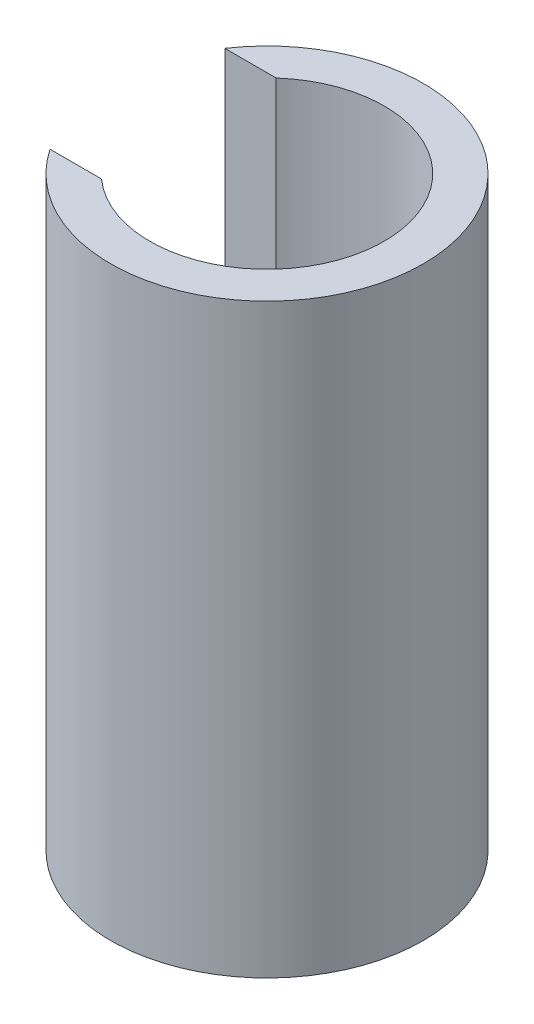
ISO-10303-21;
HEADER;
FILE_DESCRIPTION(('STEP AP214'),'2;1');
FILE_NAME('part.step','',(''),(''),'','','');
FILE_SCHEMA(('AUTOMOTIVE_DESIGN { 1 0 10303 214 1 1 1 1 }'));
ENDSEC;
DATA;
#1=APPLICATION_CONTEXT('core data for automotive mechanical design processes');
#2=APPLICATION_PROTOCOL_DEFINITION('international standard','automotive_design',2000,#1);
#3=PRODUCT_CONTEXT('',#1,'mechanical');
#4=PRODUCT('Part','Part','',(#3));
#5=PRODUCT_RELATED_PRODUCT_CATEGORY('part','',(#4));
#6=PRODUCT_DEFINITION_FORMATION('','',#4);
#7=PRODUCT_DEFINITION_CONTEXT('part definition',#1,'design');
#8=PRODUCT_DEFINITION('design','',#6,#7);
#9=PRODUCT_DEFINITION_SHAPE('','',#8);
#10=(LENGTH_UNIT() NAMED_UNIT(*) SI_UNIT(.MILLI.,.METRE.));
#11=(NAMED_UNIT(*) PLANE_ANGLE_UNIT() SI_UNIT($,.RADIAN.));
#12=(NAMED_UNIT(*) SI_UNIT($,.STERADIAN.) SOLID_ANGLE_UNIT());
#13=UNCERTAINTY_MEASURE_WITH_UNIT(LENGTH_MEASURE(1.E-05),#10,'distance_accuracy_value','');
#14=(GEOMETRIC_REPRESENTATION_CONTEXT(3) GLOBAL_UNCERTAINTY_ASSIGNED_CONTEXT((#13)) GLOBAL_UNIT_ASSIGNED_CONTEXT((#10,
#11,#12)) REPRESENTATION_CONTEXT('',''));
#15=CARTESIAN_POINT('',(0.,0.,0.));
#16=DIRECTION('',(0.,0.,1.));
#17=DIRECTION('',(1.,0.,0.));
#18=AXIS2_PLACEMENT_3D('',#15,#16,#17);
#19=CARTESIAN_POINT('',(0.,15.,0.));
#20=DIRECTION('',(0.,1.,0.));
#21=DIRECTION('',(0.,0.,1.));
#22=AXIS2_PLACEMENT_3D('',#19,#20,#21);
#23=PLANE('',#22);
#24=DIRECTION('',(-1.,0.,0.));
#25=VECTOR('',#24,1.);
#26=CARTESIAN_POINT('',(-4.,15.,-2.23606797749979));
#27=LINE('',#26,#25);
#28=CARTESIAN_POINT('',(-2.,15.,-2.23606797749979));
#29=VERTEX_POINT('',#28);
#30=CARTESIAN_POINT('',(-3.3166247903554,15.,-2.23606797749979));
#31=VERTEX_POINT('',#30);
#32=EDGE_CURVE('E97',#29,#31,#27,.T.);
#33=ORIENTED_EDGE('',*,*,#32,.F.);
#34=CARTESIAN_POINT('',(0.,15.,0.));
#35=DIRECTION('',(0.,1.,0.));
#36=DIRECTION('',(0.,0.,1.));
#37=AXIS2_PLACEMENT_3D('',#34,#35,#36);
#38=CIRCLE('',#37,3.);
#39=CARTESIAN_POINT('',(-2.,15.,2.23606797749979));
#40=VERTEX_POINT('',#39);
#41=EDGE_CURVE('E101',#40,#29,#38,.T.);
#42=ORIENTED_EDGE('',*,*,#41,.F.);
#43=DIRECTION('',(1.,0.,0.));
#44=VECTOR('',#43,1.);
#45=CARTESIAN_POINT('',(-4.,15.,2.23606797749979));
#46=LINE('',#45,#44);
#47=CARTESIAN_POINT('',(-3.3166247903554,15.,2.23606797749979));
#48=VERTEX_POINT('',#47);
#49=EDGE_CURVE('E63',#48,#40,#46,.T.);
#50=ORIENTED_EDGE('',*,*,#49,.F.);
#51=CARTESIAN_POINT('',(0.,15.,0.));
#52=DIRECTION('',(0.,1.,0.));
#53=DIRECTION('',(0.,0.,1.));
#54=AXIS2_PLACEMENT_3D('',#51,#52,#53);
#55=CIRCLE('',#54,4.);
#56=EDGE_CURVE('E11',#48,#31,#55,.T.);
#57=ORIENTED_EDGE('',*,*,#56,.T.);
#58=EDGE_LOOP('',(#33,#42,#50,#57));
#59=FACE_BOUND('',#58,.T.);
#60=ADVANCED_FACE('F39',(#59),#23,.T.);
#61=CARTESIAN_POINT('',(0.,0.,0.));
#62=DIRECTION('',(0.,1.,0.));
#63=DIRECTION('',(0.,0.,1.));
#64=AXIS2_PLACEMENT_3D('',#61,#62,#63);
#65=PLANE('',#64);
#66=CARTESIAN_POINT('',(0.,0.,0.));
#67=DIRECTION('',(0.,1.,0.));
#68=DIRECTION('',(0.,0.,1.));
#69=AXIS2_PLACEMENT_3D('',#66,#67,#68);
#70=CIRCLE('',#69,3.);
#71=CARTESIAN_POINT('',(-2.,0.,2.23606797749979));
#72=VERTEX_POINT('',#71);
#73=CARTESIAN_POINT('',(-2.,0.,-2.23606797749979));
#74=VERTEX_POINT('',#73);
#75=EDGE_CURVE('E94',#72,#74,#70,.T.);
#76=ORIENTED_EDGE('',*,*,#75,.T.);
#77=DIRECTION('',(-1.,0.,0.));
#78=VECTOR('',#77,1.);
#79=CARTESIAN_POINT('',(-4.,0.,-2.23606797749979));
#80=LINE('',#79,#78);
#81=CARTESIAN_POINT('',(-3.3166247903554,0.,-2.23606797749979));
#82=VERTEX_POINT('',#81);
#83=EDGE_CURVE('E55',#74,#82,#80,.T.);
#84=ORIENTED_EDGE('',*,*,#83,.T.);
#85=CARTESIAN_POINT('',(0.,0.,0.));
#86=DIRECTION('',(0.,1.,0.));
#87=DIRECTION('',(0.,0.,1.));
#88=AXIS2_PLACEMENT_3D('',#85,#86,#87);
#89=CIRCLE('',#88,4.);
#90=CARTESIAN_POINT('',(-3.3166247903554,0.,2.23606797749979));
#91=VERTEX_POINT('',#90);
#92=EDGE_CURVE('E43',#91,#82,#89,.T.);
#93=ORIENTED_EDGE('',*,*,#92,.F.);
#94=DIRECTION('',(1.,0.,0.));
#95=VECTOR('',#94,1.);
#96=CARTESIAN_POINT('',(-4.,0.,2.23606797749979));
#97=LINE('',#96,#95);
#98=EDGE_CURVE('E81',#91,#72,#97,.T.);
#99=ORIENTED_EDGE('',*,*,#98,.T.);
#100=EDGE_LOOP('',(#76,#84,#93,#99));
#101=FACE_BOUND('',#100,.T.);
#102=ADVANCED_FACE('F93',(#101),#65,.F.);
#103=CARTESIAN_POINT('',(0.,15.,0.));
#104=DIRECTION('',(0.,-1.,0.));
#105=DIRECTION('',(0.,0.,-1.));
#106=AXIS2_PLACEMENT_3D('',#103,#104,#105);
#107=CYLINDRICAL_SURFACE('',#106,4.);
#108=ORIENTED_EDGE('',*,*,#92,.T.);
#109=DIRECTION('',(0.,-1.,0.));
#110=VECTOR('',#109,1.);
#111=CARTESIAN_POINT('',(-3.3166247903554,15.,-2.23606797749979));
#112=LINE('',#111,#110);
#113=EDGE_CURVE('E102',#82,#31,#112,.F.);
#114=ORIENTED_EDGE('',*,*,#113,.T.);
#115=ORIENTED_EDGE('',*,*,#56,.F.);
#116=DIRECTION('',(0.,-1.,0.));
#117=VECTOR('',#116,1.);
#118=CARTESIAN_POINT('',(-3.3166247903554,15.,2.23606797749979));
#119=LINE('',#118,#117);
#120=EDGE_CURVE('E108',#48,#91,#119,.T.);
#121=ORIENTED_EDGE('',*,*,#120,.T.);
#122=EDGE_LOOP('',(#108,#114,#115,#121));
#123=FACE_BOUND('',#122,.T.);
#124=ADVANCED_FACE('F41',(#123),#107,.T.);
#125=CARTESIAN_POINT('',(0.,15.,0.));
#126=DIRECTION('',(0.,-1.,0.));
#127=DIRECTION('',(0.,0.,-1.));
#128=AXIS2_PLACEMENT_3D('',#125,#126,#127);
#129=CYLINDRICAL_SURFACE('',#128,3.);
#130=DIRECTION('',(0.,1.,0.));
#131=VECTOR('',#130,1.);
#132=CARTESIAN_POINT('',(-2.,0.,-2.23606797749979));
#133=LINE('',#132,#131);
#134=EDGE_CURVE('E88',#74,#29,#133,.T.);
#135=ORIENTED_EDGE('',*,*,#134,.F.);
#136=ORIENTED_EDGE('',*,*,#75,.F.);
#137=DIRECTION('',(0.,1.,0.));
#138=VECTOR('',#137,1.);
#139=CARTESIAN_POINT('',(-2.,0.,2.23606797749979));
#140=LINE('',#139,#138);
#141=EDGE_CURVE('E78',#72,#40,#140,.T.);
#142=ORIENTED_EDGE('',*,*,#141,.T.);
#143=ORIENTED_EDGE('',*,*,#41,.T.);
#144=EDGE_LOOP('',(#135,#136,#142,#143));
#145=FACE_BOUND('',#144,.T.);
#146=ADVANCED_FACE('F99',(#145),#129,.F.);
#147=CARTESIAN_POINT('',(-4.,0.,2.23606797749979));
#148=DIRECTION('',(0.,0.,1.));
#149=DIRECTION('',(1.,0.,0.));
#150=AXIS2_PLACEMENT_3D('',#147,#148,#149);
#151=PLANE('',#150);
#152=ORIENTED_EDGE('',*,*,#49,.T.);
#153=ORIENTED_EDGE('',*,*,#141,.F.);
#154=ORIENTED_EDGE('',*,*,#98,.F.);
#155=ORIENTED_EDGE('',*,*,#120,.F.);
#156=EDGE_LOOP('',(#152,#153,#154,#155));
#157=FACE_BOUND('',#156,.T.);
#158=ADVANCED_FACE('F80',(#157),#151,.F.);
#159=CARTESIAN_POINT('',(-4.,0.,-2.23606797749979));
#160=DIRECTION('',(0.,0.,-1.));
#161=DIRECTION('',(-1.,0.,0.));
#162=AXIS2_PLACEMENT_3D('',#159,#160,#161);
#163=PLANE('',#162);
#164=ORIENTED_EDGE('',*,*,#83,.F.);
#165=ORIENTED_EDGE('',*,*,#134,.T.);
#166=ORIENTED_EDGE('',*,*,#32,.T.);
#167=ORIENTED_EDGE('',*,*,#113,.F.);
#168=EDGE_LOOP('',(#164,#165,#166,#167));
#169=FACE_BOUND('',#168,.T.);
#170=ADVANCED_FACE('F125',(#169),#163,.F.);
#171=CLOSED_SHELL('',(#60,#102,#124,#146,#158,#170));
#172=MANIFOLD_SOLID_BREP('B2',#171);
#173=ADVANCED_BREP_SHAPE_REPRESENTATION('',(#18,#172),#14);
#174=SHAPE_DEFINITION_REPRESENTATION(#9,#173);
ENDSEC;
END-ISO-10303-21;
